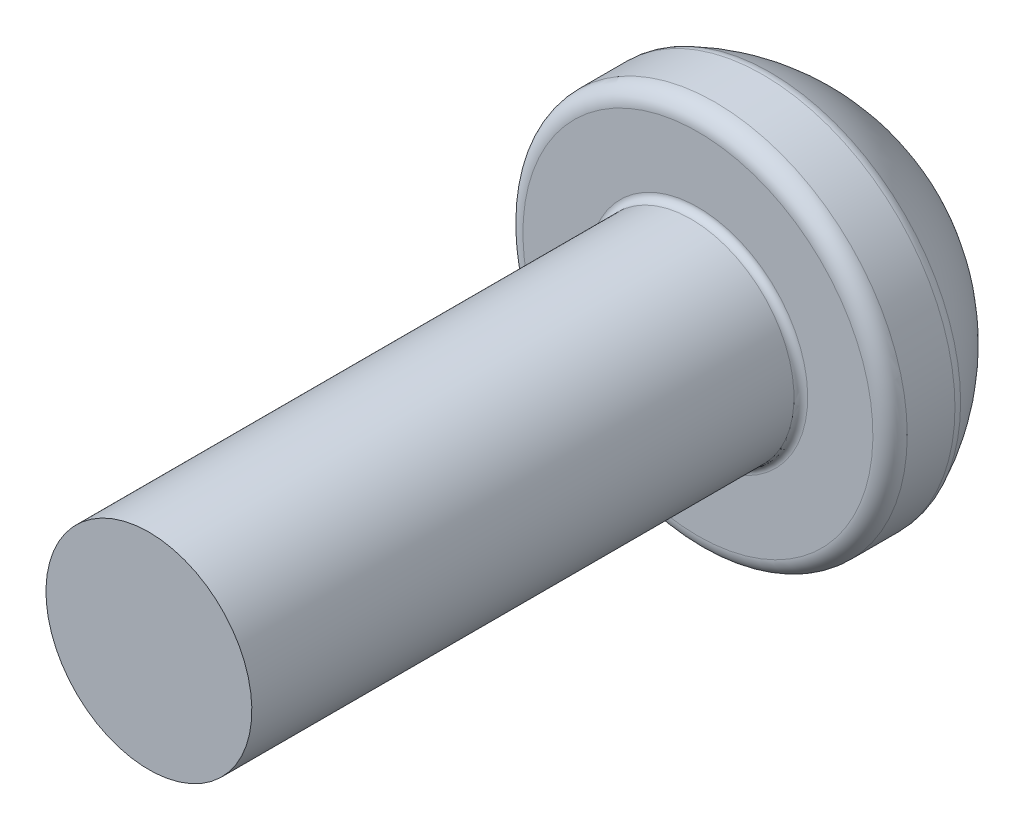
ISO-10303-21;
HEADER;
FILE_DESCRIPTION(('STEP AP214'),'2;1');
FILE_NAME('part.step','',(''),(''),'','','');
FILE_SCHEMA(('AUTOMOTIVE_DESIGN { 1 0 10303 214 1 1 1 1 }'));
ENDSEC;
DATA;
#1=APPLICATION_CONTEXT('core data for automotive mechanical design processes');
#2=APPLICATION_PROTOCOL_DEFINITION('international standard','automotive_design',2000,#1);
#3=PRODUCT_CONTEXT('',#1,'mechanical');
#4=PRODUCT('Part','Part','',(#3));
#5=PRODUCT_RELATED_PRODUCT_CATEGORY('part','',(#4));
#6=PRODUCT_DEFINITION_FORMATION('','',#4);
#7=PRODUCT_DEFINITION_CONTEXT('part definition',#1,'design');
#8=PRODUCT_DEFINITION('design','',#6,#7);
#9=PRODUCT_DEFINITION_SHAPE('','',#8);
#10=(LENGTH_UNIT() NAMED_UNIT(*) SI_UNIT(.MILLI.,.METRE.));
#11=(NAMED_UNIT(*) PLANE_ANGLE_UNIT() SI_UNIT($,.RADIAN.));
#12=(NAMED_UNIT(*) SI_UNIT($,.STERADIAN.) SOLID_ANGLE_UNIT());
#13=UNCERTAINTY_MEASURE_WITH_UNIT(LENGTH_MEASURE(1.E-05),#10,'distance_accuracy_value','');
#14=(GEOMETRIC_REPRESENTATION_CONTEXT(3) GLOBAL_UNCERTAINTY_ASSIGNED_CONTEXT((#13)) GLOBAL_UNIT_ASSIGNED_CONTEXT((#10,
#11,#12)) REPRESENTATION_CONTEXT('',''));
#15=CARTESIAN_POINT('',(0.,0.,0.));
#16=DIRECTION('',(0.,0.,1.));
#17=DIRECTION('',(1.,0.,0.));
#18=AXIS2_PLACEMENT_3D('',#15,#16,#17);
#19=CARTESIAN_POINT('',(0.,0.,7.99999999999996));
#20=DIRECTION('',(0.,0.,1.));
#21=DIRECTION('',(0.,-1.00000000000001,0.));
#22=AXIS2_PLACEMENT_3D('',#19,#20,#21);
#23=PLANE('',#22);
#24=CARTESIAN_POINT('',(0.,0.,7.99999999999996));
#25=DIRECTION('',(0.,0.,-1.));
#26=DIRECTION('',(0.,1.00000000000001,0.));
#27=AXIS2_PLACEMENT_3D('',#24,#25,#26);
#28=CIRCLE('',#27,1.5);
#29=CARTESIAN_POINT('',(0.,1.49999999999995,7.99999999999996));
#30=VERTEX_POINT('',#29);
#31=EDGE_CURVE('E266',#30,#30,#28,.T.);
#32=ORIENTED_EDGE('',*,*,#31,.F.);
#33=EDGE_LOOP('',(#32));
#34=FACE_BOUND('',#33,.T.);
#35=ADVANCED_FACE('F34',(#34),#23,.T.);
#36=CARTESIAN_POINT('',(0.,0.,-2.4));
#37=DIRECTION('',(0.,0.,-1.));
#38=DIRECTION('',(0.,1.00000000000001,0.));
#39=AXIS2_PLACEMENT_3D('',#36,#37,#38);
#40=CYLINDRICAL_SURFACE('',#39,1.5);
#41=CARTESIAN_POINT('',(0.,0.,0.0999999999999994));
#42=DIRECTION('',(0.,0.,1.));
#43=DIRECTION('',(0.,-1.00000000000001,0.));
#44=AXIS2_PLACEMENT_3D('',#41,#42,#43);
#45=CIRCLE('',#44,1.5);
#46=CARTESIAN_POINT('',(0.,-1.50000000000001,0.0999999999999975));
#47=VERTEX_POINT('',#46);
#48=EDGE_CURVE('E272',#47,#47,#45,.T.);
#49=ORIENTED_EDGE('',*,*,#48,.T.);
#50=EDGE_LOOP('',(#49));
#51=FACE_BOUND('',#50,.T.);
#52=ORIENTED_EDGE('',*,*,#31,.T.);
#53=EDGE_LOOP('',(#52));
#54=FACE_BOUND('',#53,.T.);
#55=ADVANCED_FACE('F307',(#51,#54),#40,.T.);
#56=CARTESIAN_POINT('',(0.,1.5,0.));
#57=DIRECTION('',(0.,0.,1.));
#58=DIRECTION('',(0.,-1.00000000000001,0.));
#59=AXIS2_PLACEMENT_3D('',#56,#57,#58);
#60=PLANE('',#59);
#61=CARTESIAN_POINT('',(0.,0.,0.));
#62=DIRECTION('',(0.,0.,1.));
#63=DIRECTION('',(0.,-1.00000000000001,0.));
#64=AXIS2_PLACEMENT_3D('',#61,#62,#63);
#65=CIRCLE('',#64,2.55);
#66=CARTESIAN_POINT('',(0.,-2.55000000000001,0.));
#67=VERTEX_POINT('',#66);
#68=EDGE_CURVE('E11',#67,#67,#65,.T.);
#69=ORIENTED_EDGE('',*,*,#68,.T.);
#70=EDGE_LOOP('',(#69));
#71=FACE_BOUND('',#70,.T.);
#72=CARTESIAN_POINT('',(0.,0.,0.));
#73=DIRECTION('',(0.,0.,1.));
#74=DIRECTION('',(0.,-1.00000000000001,0.));
#75=AXIS2_PLACEMENT_3D('',#72,#73,#74);
#76=CIRCLE('',#75,1.6);
#77=CARTESIAN_POINT('',(0.,-1.60000000000001,0.));
#78=VERTEX_POINT('',#77);
#79=EDGE_CURVE('E269',#78,#78,#76,.F.);
#80=ORIENTED_EDGE('',*,*,#79,.T.);
#81=EDGE_LOOP('',(#80));
#82=FACE_BOUND('',#81,.T.);
#83=ADVANCED_FACE('F312',(#71,#82),#60,.T.);
#84=CARTESIAN_POINT('',(0.,0.,-2.4));
#85=DIRECTION('',(0.,0.,-1.));
#86=DIRECTION('',(0.,1.00000000000001,0.));
#87=AXIS2_PLACEMENT_3D('',#84,#85,#86);
#88=CYLINDRICAL_SURFACE('',#87,2.8);
#89=CARTESIAN_POINT('',(0.,0.,-0.945424841825027));
#90=DIRECTION('',(0.,0.,1.));
#91=DIRECTION('',(0.,-1.00000000000001,0.));
#92=AXIS2_PLACEMENT_3D('',#89,#90,#91);
#93=CIRCLE('',#92,2.8);
#94=CARTESIAN_POINT('',(0.,-2.80000000000004,-0.94542484182503));
#95=VERTEX_POINT('',#94);
#96=EDGE_CURVE('E41',#95,#95,#93,.T.);
#97=ORIENTED_EDGE('',*,*,#96,.T.);
#98=EDGE_LOOP('',(#97));
#99=FACE_BOUND('',#98,.T.);
#100=CARTESIAN_POINT('',(0.,0.,-0.25));
#101=DIRECTION('',(0.,0.,1.));
#102=DIRECTION('',(0.,-1.00000000000001,0.));
#103=AXIS2_PLACEMENT_3D('',#100,#101,#102);
#104=CIRCLE('',#103,2.8);
#105=CARTESIAN_POINT('',(0.,-2.80000000000002,-0.250000000000004));
#106=VERTEX_POINT('',#105);
#107=EDGE_CURVE('E278',#106,#106,#104,.F.);
#108=ORIENTED_EDGE('',*,*,#107,.T.);
#109=EDGE_LOOP('',(#108));
#110=FACE_BOUND('',#109,.T.);
#111=ADVANCED_FACE('F283',(#99,#110),#88,.T.);
#112=CARTESIAN_POINT('',(0.,0.,0.253));
#113=DIRECTION('',(0.,0.,-1.));
#114=DIRECTION('',(0.,1.00000000000001,0.));
#115=AXIS2_PLACEMENT_3D('',#112,#113,#114);
#116=SPHERICAL_SURFACE('',#115,3.06757379699332);
#117=CARTESIAN_POINT('',(0.,0.,-1.05175966463463));
#118=DIRECTION('',(0.,0.,1.));
#119=DIRECTION('',(0.,-1.00000000000001,0.));
#120=AXIS2_PLACEMENT_3D('',#117,#118,#119);
#121=CIRCLE('',#120,2.77625849256558);
#122=CARTESIAN_POINT('',(0.,2.7762584925656,-1.05175966463463));
#123=VERTEX_POINT('',#122);
#124=EDGE_CURVE('E275',#123,#123,#121,.F.);
#125=CARTESIAN_POINT('',(0.,0.,-2.4));
#126=DIRECTION('',(0.,0.,-1.));
#127=DIRECTION('',(0.,1.00000000000001,0.));
#128=AXIS2_PLACEMENT_3D('',#125,#126,#127);
#129=CIRCLE('',#128,1.54);
#130=CARTESIAN_POINT('',(0.,1.54,-2.4));
#131=VERTEX_POINT('',#130);
#132=EDGE_CURVE('E262',#131,#131,#129,.T.);
#133=CARTESIAN_POINT('',(0.,2.7762584925656,-1.05175966463463));
#134=CARTESIAN_POINT('',(0.,2.7680287356093,-1.06927093928298));
#135=CARTESIAN_POINT('',(0.,2.75963325856511,-1.08670432952202));
#136=CARTESIAN_POINT('',(0.,2.74251396302795,-1.12140914487731));
#137=CARTESIAN_POINT('',(0.,2.73379014453497,-1.13868056999356));
#138=CARTESIAN_POINT('',(0.,2.71601726482718,-1.17305525879907));
#139=CARTESIAN_POINT('',(0.,2.70696820361238,-1.19015852248834));
#140=CARTESIAN_POINT('',(0.,2.68854808514227,-1.22419076788491));
#141=CARTESIAN_POINT('',(0.,2.67917702788696,-1.24111974959222));
#142=CARTESIAN_POINT('',(0.,2.66011627086748,-1.27479736870806));
#143=CARTESIAN_POINT('',(0.,2.65042657110331,-1.29154600611661));
#144=CARTESIAN_POINT('',(0.,2.63073199894965,-1.32485694000622));
#145=CARTESIAN_POINT('',(0.,2.62072712656015,-1.34141923648729));
#146=CARTESIAN_POINT('',(0.,2.60040579128122,-1.37435155831383));
#147=CARTESIAN_POINT('',(0.,2.59008932839178,-1.39072158365931));
#148=CARTESIAN_POINT('',(0.,2.56914850596594,-1.4232635019295));
#149=CARTESIAN_POINT('',(0.,2.55852414642955,-1.43943539485421));
#150=CARTESIAN_POINT('',(0.,2.53697133476197,-1.47157525791774));
#151=CARTESIAN_POINT('',(0.,2.52604288263079,-1.48754322805656));
#152=CARTESIAN_POINT('',(0.,2.50388579871807,-1.51926952820363));
#153=CARTESIAN_POINT('',(0.,2.49265716693654,-1.53502785821189));
#154=CARTESIAN_POINT('',(0.,2.46990374414404,-1.56632923581349));
#155=CARTESIAN_POINT('',(0.,2.45837895313307,-1.58187228340683));
#156=CARTESIAN_POINT('',(0.,2.43503733834351,-1.6127375309767));
#157=CARTESIAN_POINT('',(0.,2.42322051456493,-1.62805973095323));
#158=CARTESIAN_POINT('',(0.,2.39929906526432,-1.65847779716218));
#159=CARTESIAN_POINT('',(0.,2.3871944397423,-1.67357366339459));
#160=CARTESIAN_POINT('',(0.,2.36270172102674,-1.703533657027));
#161=CARTESIAN_POINT('',(0.,2.35031362783321,-1.718397784427));
#162=CARTESIAN_POINT('',(0.,2.32525840934238,-1.74788897828059));
#163=CARTESIAN_POINT('',(0.,2.31259128404508,-1.76251604473418));
#164=CARTESIAN_POINT('',(0.,2.28698253682217,-1.79152787946083));
#165=CARTESIAN_POINT('',(0.,2.27404091489656,-1.80591264773389));
#166=CARTESIAN_POINT('',(0.,2.24788780817623,-1.83443473562045));
#167=CARTESIAN_POINT('',(0.,2.23467632338152,-1.84857205523394));
#168=CARTESIAN_POINT('',(0.,2.20798822130683,-1.87659418392154));
#169=CARTESIAN_POINT('',(0.,2.19451160402686,-1.89047899299565));
#170=CARTESIAN_POINT('',(0.,2.16729806229643,-1.91799112913626));
#171=CARTESIAN_POINT('',(0.,2.15356113784597,-1.93161845620276));
#172=CARTESIAN_POINT('',(0.,2.12583190029255,-1.95861074905163));
#173=CARTESIAN_POINT('',(0.,2.11183958718959,-1.971975714834));
#174=CARTESIAN_POINT('',(0.,2.08360458229128,-1.99843849977674));
#175=CARTESIAN_POINT('',(0.,2.06936189049592,-2.01153631893711));
#176=CARTESIAN_POINT('',(0.,2.04063122782129,-2.03746012095012));
#177=CARTESIAN_POINT('',(0.,2.026143256942,-2.05028610380276));
#178=CARTESIAN_POINT('',(0.,1.99692722353021,-2.07566164084562));
#179=CARTESIAN_POINT('',(0.,1.98219916099771,-2.08821119503583));
#180=CARTESIAN_POINT('',(0.,1.95250821767573,-2.11302938137545));
#181=CARTESIAN_POINT('',(0.,1.93754533688625,-2.12529801352486));
#182=CARTESIAN_POINT('',(0.,1.90739011452163,-2.1495499629859));
#183=CARTESIAN_POINT('',(0.,1.89219777294648,-2.16153328029752));
#184=CARTESIAN_POINT('',(0.,1.86158906864721,-2.18521030945437));
#185=CARTESIAN_POINT('',(0.,1.84617270592309,-2.1969040212996));
#186=CARTESIAN_POINT('',(0.,1.81512147914839,-2.21999765254702));
#187=CARTESIAN_POINT('',(0.,1.79948661509781,-2.23139757194922));
#188=CARTESIAN_POINT('',(0.,1.76800398382114,-2.25389953668146));
#189=CARTESIAN_POINT('',(0.,1.75215621659505,-2.2650015820115));
#190=CARTESIAN_POINT('',(0.,1.72025345299826,-2.2869038230465));
#191=CARTESIAN_POINT('',(0.,1.70419845662756,-2.29770401875144));
#192=CARTESIAN_POINT('',(0.,1.67188698427809,-2.31899869521752));
#193=CARTESIAN_POINT('',(0.,1.65563050829932,-2.32949317597865));
#194=CARTESIAN_POINT('',(0.,1.62292189353214,-2.350172658651));
#195=CARTESIAN_POINT('',(0.,1.60646975474373,-2.36035766056221));
#196=CARTESIAN_POINT('',(0.,1.57337571941818,-2.38041456247664));
#197=CARTESIAN_POINT('',(0.,1.55673382288104,-2.39028646247984));
#198=CARTESIAN_POINT('',(0.,1.54,-2.4));
#199=B_SPLINE_CURVE_WITH_KNOTS('',3,(#133,#134,#135,#136,#137,#138,#139,#140,#141,#142,#143,
#144,#145,#146,#147,#148,#149,#150,#151,#152,#153,#154,#155,#156,#157,#158,#159,#160,#161,#162,
#163,#164,#165,#166,#167,#168,#169,#170,#171,#172,#173,#174,#175,#176,#177,#178,#179,#180,#181,
#182,#183,#184,#185,#186,#187,#188,#189,#190,#191,#192,#193,#194,#195,#196,#197,#198),
.UNSPECIFIED.,.F.,.F.,(4,2,2,2,2,2,2,2,2,2,2,2,2,2,2,2,2,2,2,2,2,2,2,2,2,2,2,2,2,2,2,2,4),(0.,
0.0580453449347516,0.116090689869504,0.174136034804255,0.232181379739007,0.290226724673759,
0.34827206960851,0.406317414543262,0.464362759478013,0.522408104412765,0.580453449347517,
0.638498794282269,0.696544139217021,0.754589484151772,0.812634829086524,0.870680174021276,
0.928725518956028,0.986770863890779,1.04481620882553,1.10286155376028,1.16090689869503,
1.21895224362979,1.27699758856454,1.33504293349929,1.39308827843404,1.45113362336879,
1.50917896830355,1.5672243132383,1.62526965817305,1.6833150031078,1.74136034804255,
1.7994056929773,1.85745103791206),.UNSPECIFIED.);
#200=EDGE_CURVE('BSEAM294',#123,#131,#199,.T.);
#201=ORIENTED_EDGE('',*,*,#124,.T.);
#202=ORIENTED_EDGE('',*,*,#132,.F.);
#203=ORIENTED_EDGE('',*,*,#200,.T.);
#204=ORIENTED_EDGE('',*,*,#200,.F.);
#205=EDGE_LOOP('',(#201,#203,#202,#204));
#206=FACE_BOUND('',#205,.T.);
#207=ADVANCED_FACE('F294',(#206),#116,.T.);
#208=CARTESIAN_POINT('',(0.,0.,-2.4));
#209=DIRECTION('',(0.,0.,-1.));
#210=DIRECTION('',(0.,1.00000000000001,0.));
#211=AXIS2_PLACEMENT_3D('',#208,#209,#210);
#212=PLANE('',#211);
#213=CARTESIAN_POINT('',(0.,0.,-2.4));
#214=DIRECTION('',(0.,0.,-1.));
#215=DIRECTION('',(0.,1.00000000000001,0.));
#216=AXIS2_PLACEMENT_3D('',#213,#214,#215);
#217=CIRCLE('',#216,1.4);
#218=CARTESIAN_POINT('',(0.217707917147425,-1.38296900283824,-2.40000000000004));
#219=VERTEX_POINT('',#218);
#220=CARTESIAN_POINT('',(-0.217707917147342,-1.38296900283824,-2.40000000000004));
#221=VERTEX_POINT('',#220);
#222=EDGE_CURVE('E185',#219,#221,#217,.T.);
#223=ORIENTED_EDGE('',*,*,#222,.F.);
#224=CARTESIAN_POINT('',(0.807500000000044,-1.39863102711191,-2.40000000000004));
#225=DIRECTION('',(0.,0.,1.));
#226=DIRECTION('',(0.,1.00000000000001,0.));
#227=AXIS2_PLACEMENT_3D('',#224,#225,#226);
#228=CIRCLE('',#227,0.59);
#229=CARTESIAN_POINT('',(1.08883233053075,-0.880025088273756,-2.40000000000003));
#230=VERTEX_POINT('',#229);
#231=EDGE_CURVE('E183',#230,#219,#228,.T.);
#232=ORIENTED_EDGE('',*,*,#231,.F.);
#233=CARTESIAN_POINT('',(0.,0.,-2.4));
#234=DIRECTION('',(0.,0.,-1.));
#235=DIRECTION('',(0.,1.00000000000001,0.));
#236=AXIS2_PLACEMENT_3D('',#233,#234,#235);
#237=CIRCLE('',#236,1.4);
#238=CARTESIAN_POINT('',(1.30654024767804,-0.502943914564513,-2.40000000000002));
#239=VERTEX_POINT('',#238);
#240=EDGE_CURVE('E180',#239,#230,#237,.T.);
#241=ORIENTED_EDGE('',*,*,#240,.F.);
#242=CARTESIAN_POINT('',(1.61500000000006,0.,-2.40000000000003));
#243=DIRECTION('',(0.,0.,1.));
#244=DIRECTION('',(0.,1.00000000000001,0.));
#245=AXIS2_PLACEMENT_3D('',#242,#243,#244);
#246=CIRCLE('',#245,0.59);
#247=CARTESIAN_POINT('',(1.30654024767804,0.502943914564458,-2.40000000000003));
#248=VERTEX_POINT('',#247);
#249=EDGE_CURVE('E178',#248,#239,#246,.T.);
#250=ORIENTED_EDGE('',*,*,#249,.F.);
#251=CARTESIAN_POINT('',(0.,0.,-2.4));
#252=DIRECTION('',(0.,0.,-1.));
#253=DIRECTION('',(0.,1.00000000000001,0.));
#254=AXIS2_PLACEMENT_3D('',#251,#252,#253);
#255=CIRCLE('',#254,1.4);
#256=CARTESIAN_POINT('',(1.08883233053067,0.880025088273756,-2.40000000000001));
#257=VERTEX_POINT('',#256);
#258=EDGE_CURVE('E175',#257,#248,#255,.T.);
#259=ORIENTED_EDGE('',*,*,#258,.F.);
#260=CARTESIAN_POINT('',(0.807500000000017,1.39863102711188,-2.4));
#261=DIRECTION('',(0.,0.,1.));
#262=DIRECTION('',(0.,1.00000000000001,0.));
#263=AXIS2_PLACEMENT_3D('',#260,#261,#262);
#264=CIRCLE('',#263,0.59);
#265=CARTESIAN_POINT('',(0.217707917147397,1.38296900283821,-2.40000000000003));
#266=VERTEX_POINT('',#265);
#267=EDGE_CURVE('E170',#266,#257,#264,.T.);
#268=ORIENTED_EDGE('',*,*,#267,.F.);
#269=CARTESIAN_POINT('',(0.,0.,-2.4));
#270=DIRECTION('',(0.,0.,-1.));
#271=DIRECTION('',(0.,1.00000000000001,0.));
#272=AXIS2_PLACEMENT_3D('',#269,#270,#271);
#273=CIRCLE('',#272,1.4);
#274=CARTESIAN_POINT('',(-0.217707917147369,1.38296900283816,-2.4));
#275=VERTEX_POINT('',#274);
#276=EDGE_CURVE('E168',#275,#266,#273,.T.);
#277=ORIENTED_EDGE('',*,*,#276,.F.);
#278=CARTESIAN_POINT('',(-0.807499999999933,1.39863102711182,-2.40000000000003));
#279=DIRECTION('',(0.,0.,1.));
#280=DIRECTION('',(0.,1.00000000000001,0.));
#281=AXIS2_PLACEMENT_3D('',#278,#279,#280);
#282=CIRCLE('',#281,0.59);
#283=CARTESIAN_POINT('',(-1.08883233053059,0.880025088273645,-2.4));
#284=VERTEX_POINT('',#283);
#285=EDGE_CURVE('E149',#284,#275,#282,.T.);
#286=ORIENTED_EDGE('',*,*,#285,.F.);
#287=CARTESIAN_POINT('',(0.,0.,-2.4));
#288=DIRECTION('',(0.,0.,-1.));
#289=DIRECTION('',(0.,1.00000000000001,0.));
#290=AXIS2_PLACEMENT_3D('',#287,#288,#289);
#291=CIRCLE('',#290,1.4);
#292=CARTESIAN_POINT('',(-1.30654024767798,0.502943914564513,-2.40000000000004));
#293=VERTEX_POINT('',#292);
#294=EDGE_CURVE('E158',#293,#284,#291,.T.);
#295=ORIENTED_EDGE('',*,*,#294,.F.);
#296=CARTESIAN_POINT('',(-1.61500000000001,0.,-2.40000000000004));
#297=DIRECTION('',(0.,0.,1.));
#298=DIRECTION('',(0.,1.00000000000001,0.));
#299=AXIS2_PLACEMENT_3D('',#296,#297,#298);
#300=CIRCLE('',#299,0.59);
#301=CARTESIAN_POINT('',(-1.30654024767796,-0.502943914564596,-2.40000000000003));
#302=VERTEX_POINT('',#301);
#303=EDGE_CURVE('E161',#302,#293,#300,.T.);
#304=ORIENTED_EDGE('',*,*,#303,.F.);
#305=CARTESIAN_POINT('',(0.,0.,-2.4));
#306=DIRECTION('',(0.,0.,-1.));
#307=DIRECTION('',(0.,1.00000000000001,0.));
#308=AXIS2_PLACEMENT_3D('',#305,#306,#307);
#309=CIRCLE('',#308,1.4);
#310=CARTESIAN_POINT('',(-1.08883233053061,-0.880025088273784,-2.40000000000004));
#311=VERTEX_POINT('',#310);
#312=EDGE_CURVE('E190',#311,#302,#309,.T.);
#313=ORIENTED_EDGE('',*,*,#312,.F.);
#314=CARTESIAN_POINT('',(-0.807499999999961,-1.39863102711194,-2.40000000000003));
#315=DIRECTION('',(0.,0.,1.));
#316=DIRECTION('',(0.,1.00000000000001,0.));
#317=AXIS2_PLACEMENT_3D('',#314,#315,#316);
#318=CIRCLE('',#317,0.59);
#319=EDGE_CURVE('E188',#221,#311,#318,.T.);
#320=ORIENTED_EDGE('',*,*,#319,.F.);
#321=EDGE_LOOP('',(#223,#232,#241,#250,#259,#268,#277,#286,#295,#304,#313,#320));
#322=FACE_BOUND('',#321,.T.);
#323=ORIENTED_EDGE('',*,*,#132,.T.);
#324=EDGE_LOOP('',(#323));
#325=FACE_BOUND('',#324,.T.);
#326=ADVANCED_FACE('F165',(#322,#325),#212,.T.);
#327=CARTESIAN_POINT('',(0.,0.,0.0999999999999994));
#328=DIRECTION('',(0.,0.,1.));
#329=DIRECTION('',(0.,-1.00000000000001,0.));
#330=AXIS2_PLACEMENT_3D('',#327,#328,#329);
#331=TOROIDAL_SURFACE('',#330,1.6,0.1);
#332=ORIENTED_EDGE('',*,*,#48,.F.);
#333=EDGE_LOOP('',(#332));
#334=FACE_BOUND('',#333,.T.);
#335=ORIENTED_EDGE('',*,*,#79,.F.);
#336=EDGE_LOOP('',(#335));
#337=FACE_BOUND('',#336,.T.);
#338=ADVANCED_FACE('F290',(#334,#337),#331,.F.);
#339=CARTESIAN_POINT('',(0.,0.,-0.945424841825027));
#340=DIRECTION('',(0.,0.,1.));
#341=DIRECTION('',(0.,-1.00000000000001,0.));
#342=AXIS2_PLACEMENT_3D('',#339,#340,#341);
#343=TOROIDAL_SURFACE('',#342,2.55,0.25);
#344=ORIENTED_EDGE('',*,*,#96,.F.);
#345=EDGE_LOOP('',(#344));
#346=FACE_BOUND('',#345,.T.);
#347=ORIENTED_EDGE('',*,*,#124,.F.);
#348=EDGE_LOOP('',(#347));
#349=FACE_BOUND('',#348,.T.);
#350=ADVANCED_FACE('F286',(#346,#349),#343,.T.);
#351=CARTESIAN_POINT('',(0.,0.,-0.25));
#352=DIRECTION('',(0.,0.,1.));
#353=DIRECTION('',(0.,-1.00000000000001,0.));
#354=AXIS2_PLACEMENT_3D('',#351,#352,#353);
#355=TOROIDAL_SURFACE('',#354,2.55,0.25);
#356=ORIENTED_EDGE('',*,*,#68,.F.);
#357=EDGE_LOOP('',(#356));
#358=FACE_BOUND('',#357,.T.);
#359=ORIENTED_EDGE('',*,*,#107,.F.);
#360=EDGE_LOOP('',(#359));
#361=FACE_BOUND('',#360,.T.);
#362=ADVANCED_FACE('F289',(#358,#361),#355,.T.);
#363=CARTESIAN_POINT('',(-1.61499999999995,0.,-1.40000000000004));
#364=DIRECTION('',(0.,0.,-1.));
#365=DIRECTION('',(0.,1.00000000000001,0.));
#366=AXIS2_PLACEMENT_3D('',#363,#364,#365);
#367=CYLINDRICAL_SURFACE('',#366,0.59);
#368=CARTESIAN_POINT('',(-1.61499999999995,0.,-1.40000000000004));
#369=DIRECTION('',(0.,0.,1.));
#370=DIRECTION('',(0.,1.00000000000001,0.));
#371=AXIS2_PLACEMENT_3D('',#368,#369,#370);
#372=CIRCLE('',#371,0.59);
#373=CARTESIAN_POINT('',(-1.30654024767798,-0.502943914564596,-1.40000000000003));
#374=VERTEX_POINT('',#373);
#375=CARTESIAN_POINT('',(-1.02499999999994,0.,-1.40000000000004));
#376=VERTEX_POINT('',#375);
#377=EDGE_CURVE('E194',#374,#376,#372,.T.);
#378=ORIENTED_EDGE('',*,*,#377,.F.);
#379=DIRECTION('',(0.,0.,-1.));
#380=VECTOR('',#379,1.);
#381=CARTESIAN_POINT('',(-1.30654024767798,-0.502943914564596,-1.40000000000003));
#382=LINE('',#381,#380);
#383=EDGE_CURVE('E229',#374,#302,#382,.T.);
#384=ORIENTED_EDGE('',*,*,#383,.T.);
#385=ORIENTED_EDGE('',*,*,#303,.T.);
#386=DIRECTION('',(0.,0.,-1.));
#387=VECTOR('',#386,1.);
#388=CARTESIAN_POINT('',(-1.30654024767798,0.50294391456443,-1.40000000000004));
#389=LINE('',#388,#387);
#390=CARTESIAN_POINT('',(-1.30654024767798,0.50294391456443,-1.40000000000004));
#391=VERTEX_POINT('',#390);
#392=EDGE_CURVE('E48',#391,#293,#389,.T.);
#393=ORIENTED_EDGE('',*,*,#392,.F.);
#394=EDGE_CURVE('E193',#376,#391,#372,.T.);
#395=ORIENTED_EDGE('',*,*,#394,.F.);
#396=EDGE_LOOP('',(#378,#384,#385,#393,#395));
#397=FACE_BOUND('',#396,.T.);
#398=ADVANCED_FACE('F356',(#397),#367,.T.);
#399=CARTESIAN_POINT('',(-0.807499999999933,-1.39863102711199,-1.40000000000004));
#400=DIRECTION('',(0.,0.,-1.));
#401=DIRECTION('',(0.,1.00000000000001,0.));
#402=AXIS2_PLACEMENT_3D('',#399,#400,#401);
#403=CYLINDRICAL_SURFACE('',#402,0.59);
#404=CARTESIAN_POINT('',(-0.807499999999933,-1.39863102711199,-1.40000000000004));
#405=DIRECTION('',(0.,0.,1.));
#406=DIRECTION('',(0.,1.00000000000001,0.));
#407=AXIS2_PLACEMENT_3D('',#404,#405,#406);
#408=CIRCLE('',#407,0.59);
#409=CARTESIAN_POINT('',(-0.217707917147258,-1.3829690028383,-1.40000000000004));
#410=VERTEX_POINT('',#409);
#411=CARTESIAN_POINT('',(-0.512499999999888,-0.887676038879071,-1.40000000000003));
#412=VERTEX_POINT('',#411);
#413=EDGE_CURVE('E223',#410,#412,#408,.T.);
#414=ORIENTED_EDGE('',*,*,#413,.F.);
#415=DIRECTION('',(0.,0.,-1.));
#416=VECTOR('',#415,1.);
#417=CARTESIAN_POINT('',(-0.217707917147258,-1.3829690028383,-1.40000000000004));
#418=LINE('',#417,#416);
#419=EDGE_CURVE('E236',#410,#221,#418,.T.);
#420=ORIENTED_EDGE('',*,*,#419,.T.);
#421=ORIENTED_EDGE('',*,*,#319,.T.);
#422=DIRECTION('',(0.,0.,-1.));
#423=VECTOR('',#422,1.);
#424=CARTESIAN_POINT('',(-1.08883233053061,-0.880025088273811,-1.40000000000004));
#425=LINE('',#424,#423);
#426=CARTESIAN_POINT('',(-1.08883233053061,-0.880025088273811,-1.40000000000004));
#427=VERTEX_POINT('',#426);
#428=EDGE_CURVE('E233',#427,#311,#425,.T.);
#429=ORIENTED_EDGE('',*,*,#428,.F.);
#430=EDGE_CURVE('E222',#412,#427,#408,.T.);
#431=ORIENTED_EDGE('',*,*,#430,.F.);
#432=EDGE_LOOP('',(#414,#420,#421,#429,#431));
#433=FACE_BOUND('',#432,.T.);
#434=ADVANCED_FACE('F367',(#433),#403,.T.);
#435=CARTESIAN_POINT('',(0.8075000000001,-1.39863102711188,-1.40000000000002));
#436=DIRECTION('',(0.,0.,-1.));
#437=DIRECTION('',(0.,1.00000000000001,0.));
#438=AXIS2_PLACEMENT_3D('',#435,#436,#437);
#439=CYLINDRICAL_SURFACE('',#438,0.59);
#440=CARTESIAN_POINT('',(0.8075000000001,-1.39863102711188,-1.40000000000002));
#441=DIRECTION('',(0.,0.,1.));
#442=DIRECTION('',(0.,1.00000000000001,0.));
#443=AXIS2_PLACEMENT_3D('',#440,#441,#442);
#444=CIRCLE('',#443,0.59);
#445=CARTESIAN_POINT('',(1.08883233053075,-0.880025088273756,-1.40000000000003));
#446=VERTEX_POINT('',#445);
#447=CARTESIAN_POINT('',(0.51250000000011,-0.887676038879071,-1.40000000000004));
#448=VERTEX_POINT('',#447);
#449=EDGE_CURVE('E216',#446,#448,#444,.T.);
#450=ORIENTED_EDGE('',*,*,#449,.F.);
#451=DIRECTION('',(0.,0.,-1.));
#452=VECTOR('',#451,1.);
#453=CARTESIAN_POINT('',(1.08883233053075,-0.880025088273756,-1.40000000000003));
#454=LINE('',#453,#452);
#455=EDGE_CURVE('E242',#446,#230,#454,.T.);
#456=ORIENTED_EDGE('',*,*,#455,.T.);
#457=ORIENTED_EDGE('',*,*,#231,.T.);
#458=DIRECTION('',(0.,0.,-1.));
#459=VECTOR('',#458,1.);
#460=CARTESIAN_POINT('',(0.217707917147397,-1.3829690028383,-1.40000000000004));
#461=LINE('',#460,#459);
#462=CARTESIAN_POINT('',(0.217707917147397,-1.3829690028383,-1.40000000000004));
#463=VERTEX_POINT('',#462);
#464=EDGE_CURVE('E239',#463,#219,#461,.T.);
#465=ORIENTED_EDGE('',*,*,#464,.F.);
#466=EDGE_CURVE('E215',#448,#463,#444,.T.);
#467=ORIENTED_EDGE('',*,*,#466,.F.);
#468=EDGE_LOOP('',(#450,#456,#457,#465,#467));
#469=FACE_BOUND('',#468,.T.);
#470=ADVANCED_FACE('F377',(#469),#439,.T.);
#471=CARTESIAN_POINT('',(1.61500000000006,0.,-1.40000000000003));
#472=DIRECTION('',(0.,0.,-1.));
#473=DIRECTION('',(0.,1.00000000000001,0.));
#474=AXIS2_PLACEMENT_3D('',#471,#472,#473);
#475=CYLINDRICAL_SURFACE('',#474,0.59);
#476=CARTESIAN_POINT('',(1.61500000000006,0.,-1.40000000000003));
#477=DIRECTION('',(0.,0.,1.));
#478=DIRECTION('',(0.,1.00000000000001,0.));
#479=AXIS2_PLACEMENT_3D('',#476,#477,#478);
#480=CIRCLE('',#479,0.59);
#481=CARTESIAN_POINT('',(1.3065402476781,0.502943914564402,-1.4));
#482=VERTEX_POINT('',#481);
#483=CARTESIAN_POINT('',(1.02500000000011,0.,-1.40000000000003));
#484=VERTEX_POINT('',#483);
#485=EDGE_CURVE('E209',#482,#484,#480,.T.);
#486=ORIENTED_EDGE('',*,*,#485,.F.);
#487=DIRECTION('',(0.,0.,-1.));
#488=VECTOR('',#487,1.);
#489=CARTESIAN_POINT('',(1.3065402476781,0.502943914564402,-1.4));
#490=LINE('',#489,#488);
#491=EDGE_CURVE('E248',#482,#248,#490,.T.);
#492=ORIENTED_EDGE('',*,*,#491,.T.);
#493=ORIENTED_EDGE('',*,*,#249,.T.);
#494=DIRECTION('',(0.,0.,-1.));
#495=VECTOR('',#494,1.);
#496=CARTESIAN_POINT('',(1.30654024767807,-0.502943914564513,-1.4));
#497=LINE('',#496,#495);
#498=CARTESIAN_POINT('',(1.30654024767807,-0.502943914564513,-1.4));
#499=VERTEX_POINT('',#498);
#500=EDGE_CURVE('E245',#499,#239,#497,.T.);
#501=ORIENTED_EDGE('',*,*,#500,.F.);
#502=EDGE_CURVE('E208',#484,#499,#480,.T.);
#503=ORIENTED_EDGE('',*,*,#502,.F.);
#504=EDGE_LOOP('',(#486,#492,#493,#501,#503));
#505=FACE_BOUND('',#504,.T.);
#506=ADVANCED_FACE('F387',(#505),#475,.T.);
#507=CARTESIAN_POINT('',(0.807500000000044,1.39863102711182,-1.4));
#508=DIRECTION('',(0.,0.,-1.));
#509=DIRECTION('',(0.,1.00000000000001,0.));
#510=AXIS2_PLACEMENT_3D('',#507,#508,#509);
#511=CYLINDRICAL_SURFACE('',#510,0.59);
#512=CARTESIAN_POINT('',(0.807500000000044,1.39863102711182,-1.4));
#513=DIRECTION('',(0.,0.,1.));
#514=DIRECTION('',(0.,1.00000000000001,0.));
#515=AXIS2_PLACEMENT_3D('',#512,#513,#514);
#516=CIRCLE('',#515,0.59);
#517=CARTESIAN_POINT('',(0.217707917147481,1.38296900283819,-1.40000000000003));
#518=VERTEX_POINT('',#517);
#519=CARTESIAN_POINT('',(0.51250000000011,0.887676038879043,-1.40000000000001));
#520=VERTEX_POINT('',#519);
#521=EDGE_CURVE('E56',#518,#520,#516,.T.);
#522=ORIENTED_EDGE('',*,*,#521,.F.);
#523=DIRECTION('',(0.,0.,-1.));
#524=VECTOR('',#523,1.);
#525=CARTESIAN_POINT('',(0.217707917147481,1.38296900283819,-1.40000000000003));
#526=LINE('',#525,#524);
#527=EDGE_CURVE('E254',#518,#266,#526,.T.);
#528=ORIENTED_EDGE('',*,*,#527,.T.);
#529=ORIENTED_EDGE('',*,*,#267,.T.);
#530=DIRECTION('',(0.,0.,-1.));
#531=VECTOR('',#530,1.);
#532=CARTESIAN_POINT('',(1.08883233053067,0.8800250882737,-1.40000000000001));
#533=LINE('',#532,#531);
#534=CARTESIAN_POINT('',(1.08883233053067,0.8800250882737,-1.40000000000001));
#535=VERTEX_POINT('',#534);
#536=EDGE_CURVE('E251',#535,#257,#533,.T.);
#537=ORIENTED_EDGE('',*,*,#536,.F.);
#538=EDGE_CURVE('E203',#520,#535,#516,.T.);
#539=ORIENTED_EDGE('',*,*,#538,.F.);
#540=EDGE_LOOP('',(#522,#528,#529,#537,#539));
#541=FACE_BOUND('',#540,.T.);
#542=ADVANCED_FACE('F397',(#541),#511,.T.);
#543=CARTESIAN_POINT('',(-0.807499999999933,1.39863102711182,-1.40000000000003));
#544=DIRECTION('',(0.,0.,-1.));
#545=DIRECTION('',(0.,1.00000000000001,0.));
#546=AXIS2_PLACEMENT_3D('',#543,#544,#545);
#547=CYLINDRICAL_SURFACE('',#546,0.59);
#548=CARTESIAN_POINT('',(-0.807499999999933,1.39863102711182,-1.40000000000003));
#549=DIRECTION('',(0.,0.,1.));
#550=DIRECTION('',(0.,1.00000000000001,0.));
#551=AXIS2_PLACEMENT_3D('',#548,#549,#550);
#552=CIRCLE('',#551,0.59);
#553=CARTESIAN_POINT('',(-1.08883233053059,0.880025088273645,-1.4));
#554=VERTEX_POINT('',#553);
#555=CARTESIAN_POINT('',(-0.512499999999888,0.887676038878987,-1.40000000000001));
#556=VERTEX_POINT('',#555);
#557=EDGE_CURVE('E153',#554,#556,#552,.T.);
#558=ORIENTED_EDGE('',*,*,#557,.F.);
#559=DIRECTION('',(0.,0.,-1.));
#560=VECTOR('',#559,1.);
#561=CARTESIAN_POINT('',(-1.08883233053059,0.880025088273645,-1.4));
#562=LINE('',#561,#560);
#563=EDGE_CURVE('E145',#554,#284,#562,.T.);
#564=ORIENTED_EDGE('',*,*,#563,.T.);
#565=ORIENTED_EDGE('',*,*,#285,.T.);
#566=DIRECTION('',(0.,0.,-1.));
#567=VECTOR('',#566,1.);
#568=CARTESIAN_POINT('',(-0.217707917147369,1.38296900283816,-1.4));
#569=LINE('',#568,#567);
#570=CARTESIAN_POINT('',(-0.217707917147369,1.38296900283816,-1.4));
#571=VERTEX_POINT('',#570);
#572=EDGE_CURVE('E155',#571,#275,#569,.T.);
#573=ORIENTED_EDGE('',*,*,#572,.F.);
#574=EDGE_CURVE('E199',#556,#571,#552,.T.);
#575=ORIENTED_EDGE('',*,*,#574,.F.);
#576=EDGE_LOOP('',(#558,#564,#565,#573,#575));
#577=FACE_BOUND('',#576,.T.);
#578=ADVANCED_FACE('F146',(#577),#547,.T.);
#579=CARTESIAN_POINT('',(-0.807499999999933,0.,-1.40000000000003));
#580=DIRECTION('',(0.,0.,-1.));
#581=DIRECTION('',(0.,1.00000000000001,0.));
#582=AXIS2_PLACEMENT_3D('',#579,#580,#581);
#583=PLANE('',#582);
#584=CARTESIAN_POINT('',(1.11022302462516E-13,0.,-1.4));
#585=DIRECTION('',(0.,0.,-1.));
#586=DIRECTION('',(0.,1.00000000000001,0.));
#587=AXIS2_PLACEMENT_3D('',#584,#585,#586);
#588=CIRCLE('',#587,1.025);
#589=EDGE_CURVE('E556',#376,#556,#588,.T.);
#590=ORIENTED_EDGE('',*,*,#589,.F.);
#591=ORIENTED_EDGE('',*,*,#394,.T.);
#592=CARTESIAN_POINT('',(1.11022302462516E-13,0.,-1.4));
#593=DIRECTION('',(0.,0.,-1.));
#594=DIRECTION('',(0.,1.00000000000001,0.));
#595=AXIS2_PLACEMENT_3D('',#592,#593,#594);
#596=CIRCLE('',#595,1.4);
#597=EDGE_CURVE('E197',#391,#554,#596,.T.);
#598=ORIENTED_EDGE('',*,*,#597,.T.);
#599=ORIENTED_EDGE('',*,*,#557,.T.);
#600=EDGE_LOOP('',(#590,#591,#598,#599));
#601=FACE_BOUND('',#600,.T.);
#602=ADVANCED_FACE('F416',(#601),#583,.T.);
#603=EDGE_CURVE('E554',#412,#376,#588,.T.);
#604=ORIENTED_EDGE('',*,*,#603,.F.);
#605=ORIENTED_EDGE('',*,*,#430,.T.);
#606=CARTESIAN_POINT('',(1.11022302462516E-13,0.,-1.4));
#607=DIRECTION('',(0.,0.,-1.));
#608=DIRECTION('',(0.,1.00000000000001,0.));
#609=AXIS2_PLACEMENT_3D('',#606,#607,#608);
#610=CIRCLE('',#609,1.4);
#611=EDGE_CURVE('E226',#427,#374,#610,.T.);
#612=ORIENTED_EDGE('',*,*,#611,.T.);
#613=ORIENTED_EDGE('',*,*,#377,.T.);
#614=EDGE_LOOP('',(#604,#605,#612,#613));
#615=FACE_BOUND('',#614,.T.);
#616=ADVANCED_FACE('F425',(#615),#583,.T.);
#617=EDGE_CURVE('E553',#448,#412,#588,.T.);
#618=ORIENTED_EDGE('',*,*,#617,.F.);
#619=ORIENTED_EDGE('',*,*,#466,.T.);
#620=CARTESIAN_POINT('',(1.11022302462516E-13,0.,-1.4));
#621=DIRECTION('',(0.,0.,-1.));
#622=DIRECTION('',(0.,1.00000000000001,0.));
#623=AXIS2_PLACEMENT_3D('',#620,#621,#622);
#624=CIRCLE('',#623,1.4);
#625=EDGE_CURVE('E219',#463,#410,#624,.T.);
#626=ORIENTED_EDGE('',*,*,#625,.T.);
#627=ORIENTED_EDGE('',*,*,#413,.T.);
#628=EDGE_LOOP('',(#618,#619,#626,#627));
#629=FACE_BOUND('',#628,.T.);
#630=ADVANCED_FACE('F436',(#629),#583,.T.);
#631=EDGE_CURVE('E263',#484,#448,#588,.T.);
#632=ORIENTED_EDGE('',*,*,#631,.F.);
#633=ORIENTED_EDGE('',*,*,#502,.T.);
#634=CARTESIAN_POINT('',(1.11022302462516E-13,0.,-1.4));
#635=DIRECTION('',(0.,0.,-1.));
#636=DIRECTION('',(0.,1.00000000000001,0.));
#637=AXIS2_PLACEMENT_3D('',#634,#635,#636);
#638=CIRCLE('',#637,1.4);
#639=EDGE_CURVE('E212',#499,#446,#638,.T.);
#640=ORIENTED_EDGE('',*,*,#639,.T.);
#641=ORIENTED_EDGE('',*,*,#449,.T.);
#642=EDGE_LOOP('',(#632,#633,#640,#641));
#643=FACE_BOUND('',#642,.T.);
#644=ADVANCED_FACE('F445',(#643),#583,.T.);
#645=EDGE_CURVE('E259',#520,#484,#588,.T.);
#646=ORIENTED_EDGE('',*,*,#645,.F.);
#647=ORIENTED_EDGE('',*,*,#538,.T.);
#648=CARTESIAN_POINT('',(1.11022302462516E-13,0.,-1.4));
#649=DIRECTION('',(0.,0.,-1.));
#650=DIRECTION('',(0.,1.00000000000001,0.));
#651=AXIS2_PLACEMENT_3D('',#648,#649,#650);
#652=CIRCLE('',#651,1.4);
#653=EDGE_CURVE('E205',#535,#482,#652,.T.);
#654=ORIENTED_EDGE('',*,*,#653,.T.);
#655=ORIENTED_EDGE('',*,*,#485,.T.);
#656=EDGE_LOOP('',(#646,#647,#654,#655));
#657=FACE_BOUND('',#656,.T.);
#658=ADVANCED_FACE('F454',(#657),#583,.T.);
#659=EDGE_CURVE('E232',#556,#520,#588,.T.);
#660=ORIENTED_EDGE('',*,*,#659,.F.);
#661=ORIENTED_EDGE('',*,*,#574,.T.);
#662=CARTESIAN_POINT('',(1.11022302462516E-13,0.,-1.4));
#663=DIRECTION('',(0.,0.,-1.));
#664=DIRECTION('',(0.,1.00000000000001,0.));
#665=AXIS2_PLACEMENT_3D('',#662,#663,#664);
#666=CIRCLE('',#665,1.4);
#667=EDGE_CURVE('E201',#571,#518,#666,.T.);
#668=ORIENTED_EDGE('',*,*,#667,.T.);
#669=ORIENTED_EDGE('',*,*,#521,.T.);
#670=EDGE_LOOP('',(#660,#661,#668,#669));
#671=FACE_BOUND('',#670,.T.);
#672=ADVANCED_FACE('F428',(#671),#583,.T.);
#673=CARTESIAN_POINT('',(1.11022302462516E-13,0.,-1.4));
#674=DIRECTION('',(0.,0.,-1.));
#675=DIRECTION('',(0.,1.00000000000001,0.));
#676=AXIS2_PLACEMENT_3D('',#673,#674,#675);
#677=CYLINDRICAL_SURFACE('',#676,1.4);
#678=ORIENTED_EDGE('',*,*,#312,.T.);
#679=ORIENTED_EDGE('',*,*,#383,.F.);
#680=ORIENTED_EDGE('',*,*,#611,.F.);
#681=ORIENTED_EDGE('',*,*,#428,.T.);
#682=EDGE_LOOP('',(#678,#679,#680,#681));
#683=FACE_BOUND('',#682,.T.);
#684=ADVANCED_FACE('F471',(#683),#677,.F.);
#685=CARTESIAN_POINT('',(1.11022302462516E-13,0.,-1.4));
#686=DIRECTION('',(0.,0.,-1.));
#687=DIRECTION('',(0.,1.00000000000001,0.));
#688=AXIS2_PLACEMENT_3D('',#685,#686,#687);
#689=CYLINDRICAL_SURFACE('',#688,1.4);
#690=ORIENTED_EDGE('',*,*,#222,.T.);
#691=ORIENTED_EDGE('',*,*,#419,.F.);
#692=ORIENTED_EDGE('',*,*,#625,.F.);
#693=ORIENTED_EDGE('',*,*,#464,.T.);
#694=EDGE_LOOP('',(#690,#691,#692,#693));
#695=FACE_BOUND('',#694,.T.);
#696=ADVANCED_FACE('F479',(#695),#689,.F.);
#697=CARTESIAN_POINT('',(1.11022302462516E-13,0.,-1.4));
#698=DIRECTION('',(0.,0.,-1.));
#699=DIRECTION('',(0.,1.00000000000001,0.));
#700=AXIS2_PLACEMENT_3D('',#697,#698,#699);
#701=CYLINDRICAL_SURFACE('',#700,1.4);
#702=ORIENTED_EDGE('',*,*,#240,.T.);
#703=ORIENTED_EDGE('',*,*,#455,.F.);
#704=ORIENTED_EDGE('',*,*,#639,.F.);
#705=ORIENTED_EDGE('',*,*,#500,.T.);
#706=EDGE_LOOP('',(#702,#703,#704,#705));
#707=FACE_BOUND('',#706,.T.);
#708=ADVANCED_FACE('F489',(#707),#701,.F.);
#709=CARTESIAN_POINT('',(1.11022302462516E-13,0.,-1.4));
#710=DIRECTION('',(0.,0.,-1.));
#711=DIRECTION('',(0.,1.00000000000001,0.));
#712=AXIS2_PLACEMENT_3D('',#709,#710,#711);
#713=CYLINDRICAL_SURFACE('',#712,1.4);
#714=ORIENTED_EDGE('',*,*,#258,.T.);
#715=ORIENTED_EDGE('',*,*,#491,.F.);
#716=ORIENTED_EDGE('',*,*,#653,.F.);
#717=ORIENTED_EDGE('',*,*,#536,.T.);
#718=EDGE_LOOP('',(#714,#715,#716,#717));
#719=FACE_BOUND('',#718,.T.);
#720=ADVANCED_FACE('F499',(#719),#713,.F.);
#721=CARTESIAN_POINT('',(1.11022302462516E-13,0.,-1.4));
#722=DIRECTION('',(0.,0.,-1.));
#723=DIRECTION('',(0.,1.00000000000001,0.));
#724=AXIS2_PLACEMENT_3D('',#721,#722,#723);
#725=CYLINDRICAL_SURFACE('',#724,1.4);
#726=ORIENTED_EDGE('',*,*,#276,.T.);
#727=ORIENTED_EDGE('',*,*,#527,.F.);
#728=ORIENTED_EDGE('',*,*,#667,.F.);
#729=ORIENTED_EDGE('',*,*,#572,.T.);
#730=EDGE_LOOP('',(#726,#727,#728,#729));
#731=FACE_BOUND('',#730,.T.);
#732=ADVANCED_FACE('F509',(#731),#725,.F.);
#733=CARTESIAN_POINT('',(1.11022302462516E-13,0.,-1.4));
#734=DIRECTION('',(0.,0.,-1.));
#735=DIRECTION('',(0.,1.00000000000001,0.));
#736=AXIS2_PLACEMENT_3D('',#733,#734,#735);
#737=CYLINDRICAL_SURFACE('',#736,1.4);
#738=ORIENTED_EDGE('',*,*,#294,.T.);
#739=ORIENTED_EDGE('',*,*,#563,.F.);
#740=ORIENTED_EDGE('',*,*,#597,.F.);
#741=ORIENTED_EDGE('',*,*,#392,.T.);
#742=EDGE_LOOP('',(#738,#739,#740,#741));
#743=FACE_BOUND('',#742,.T.);
#744=ADVANCED_FACE('F159',(#743),#737,.F.);
#745=CARTESIAN_POINT('',(1.11022302462516E-13,0.,-1.4));
#746=DIRECTION('',(0.,0.,-1.));
#747=DIRECTION('',(0.,1.00000000000001,0.));
#748=AXIS2_PLACEMENT_3D('',#745,#746,#747);
#749=CONICAL_SURFACE('',#748,1.025,1.22173047639603);
#750=CARTESIAN_POINT('',(0.,0.,-1.02693050987715));
#751=VERTEX_POINT('',#750);
#752=VERTEX_LOOP('',#751);
#753=FACE_BOUND('',#752,.T.);
#754=ORIENTED_EDGE('',*,*,#645,.T.);
#755=ORIENTED_EDGE('',*,*,#631,.T.);
#756=ORIENTED_EDGE('',*,*,#617,.T.);
#757=ORIENTED_EDGE('',*,*,#603,.T.);
#758=ORIENTED_EDGE('',*,*,#589,.T.);
#759=ORIENTED_EDGE('',*,*,#659,.T.);
#760=EDGE_LOOP('',(#754,#755,#756,#757,#758,#759));
#761=FACE_BOUND('',#760,.T.);
#762=ADVANCED_FACE('F528',(#753,#761),#749,.F.);
#763=CLOSED_SHELL('',(#35,#55,#83,#111,#207,#326,#338,#350,#362,#398,#434,#470,#506,#542,#578,
#602,#616,#630,#644,#658,#672,#684,#696,#708,#720,#732,#744,#762));
#764=MANIFOLD_SOLID_BREP('B2',#763);
#765=ADVANCED_BREP_SHAPE_REPRESENTATION('',(#18,#764),#14);
#766=SHAPE_DEFINITION_REPRESENTATION(#9,#765);
ENDSEC;
END-ISO-10303-21;
